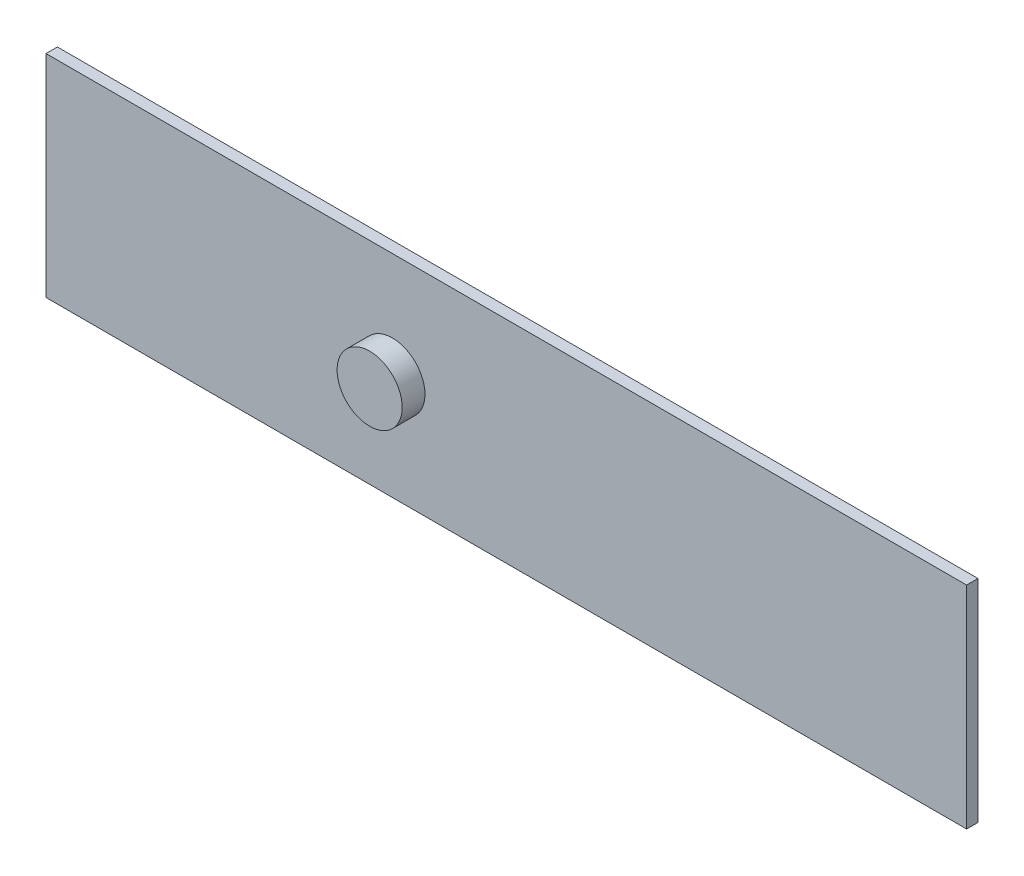
ISO-10303-21;
HEADER;
FILE_DESCRIPTION(('STEP AP214'),'2;1');
FILE_NAME('part.step','',(''),(''),'','','');
FILE_SCHEMA(('AUTOMOTIVE_DESIGN { 1 0 10303 214 1 1 1 1 }'));
ENDSEC;
DATA;
#1=APPLICATION_CONTEXT('core data for automotive mechanical design processes');
#2=APPLICATION_PROTOCOL_DEFINITION('international standard','automotive_design',2000,#1);
#3=PRODUCT_CONTEXT('',#1,'mechanical');
#4=PRODUCT('Part','Part','',(#3));
#5=PRODUCT_RELATED_PRODUCT_CATEGORY('part','',(#4));
#6=PRODUCT_DEFINITION_FORMATION('','',#4);
#7=PRODUCT_DEFINITION_CONTEXT('part definition',#1,'design');
#8=PRODUCT_DEFINITION('design','',#6,#7);
#9=PRODUCT_DEFINITION_SHAPE('','',#8);
#10=(LENGTH_UNIT() NAMED_UNIT(*) SI_UNIT(.MILLI.,.METRE.));
#11=(NAMED_UNIT(*) PLANE_ANGLE_UNIT() SI_UNIT($,.RADIAN.));
#12=(NAMED_UNIT(*) SI_UNIT($,.STERADIAN.) SOLID_ANGLE_UNIT());
#13=UNCERTAINTY_MEASURE_WITH_UNIT(LENGTH_MEASURE(1.E-05),#10,'distance_accuracy_value','');
#14=(GEOMETRIC_REPRESENTATION_CONTEXT(3) GLOBAL_UNCERTAINTY_ASSIGNED_CONTEXT((#13)) GLOBAL_UNIT_ASSIGNED_CONTEXT((#10,
#11,#12)) REPRESENTATION_CONTEXT('',''));
#15=CARTESIAN_POINT('',(0.,0.,0.));
#16=DIRECTION('',(0.,0.,1.));
#17=DIRECTION('',(1.,0.,0.));
#18=AXIS2_PLACEMENT_3D('',#15,#16,#17);
#19=CARTESIAN_POINT('',(-282.94,-64.94,3.5));
#20=DIRECTION('',(0.,1.,0.));
#21=DIRECTION('',(-1.,0.,0.));
#22=AXIS2_PLACEMENT_3D('',#19,#20,#21);
#23=PLANE('',#22);
#24=DIRECTION('',(1.,0.,0.));
#25=VECTOR('',#24,1.);
#26=CARTESIAN_POINT('',(-282.94,-64.94,-3.5));
#27=LINE('',#26,#25);
#28=CARTESIAN_POINT('',(-282.94,-64.94,-3.5));
#29=VERTEX_POINT('',#28);
#30=CARTESIAN_POINT('',(282.94,-64.94,-3.5));
#31=VERTEX_POINT('',#30);
#32=EDGE_CURVE('E99',#29,#31,#27,.T.);
#33=ORIENTED_EDGE('',*,*,#32,.T.);
#34=DIRECTION('',(0.,0.,-1.));
#35=VECTOR('',#34,1.);
#36=CARTESIAN_POINT('',(282.94,-64.94,3.5));
#37=LINE('',#36,#35);
#38=CARTESIAN_POINT('',(282.94,-64.94,3.5));
#39=VERTEX_POINT('',#38);
#40=EDGE_CURVE('E11',#39,#31,#37,.T.);
#41=ORIENTED_EDGE('',*,*,#40,.F.);
#42=DIRECTION('',(1.,0.,0.));
#43=VECTOR('',#42,1.);
#44=CARTESIAN_POINT('',(-282.94,-64.94,3.5));
#45=LINE('',#44,#43);
#46=CARTESIAN_POINT('',(-282.94,-64.94,3.5));
#47=VERTEX_POINT('',#46);
#48=EDGE_CURVE('E87',#47,#39,#45,.T.);
#49=ORIENTED_EDGE('',*,*,#48,.F.);
#50=DIRECTION('',(0.,0.,-1.));
#51=VECTOR('',#50,1.);
#52=CARTESIAN_POINT('',(-282.94,-64.94,3.5));
#53=LINE('',#52,#51);
#54=EDGE_CURVE('E95',#47,#29,#53,.T.);
#55=ORIENTED_EDGE('',*,*,#54,.T.);
#56=EDGE_LOOP('',(#33,#41,#49,#55));
#57=FACE_BOUND('',#56,.T.);
#58=ADVANCED_FACE('F36',(#57),#23,.F.);
#59=CARTESIAN_POINT('',(282.94,-64.94,3.5));
#60=DIRECTION('',(-1.,0.,0.));
#61=DIRECTION('',(0.,0.,1.));
#62=AXIS2_PLACEMENT_3D('',#59,#60,#61);
#63=PLANE('',#62);
#64=DIRECTION('',(0.,1.,0.));
#65=VECTOR('',#64,1.);
#66=CARTESIAN_POINT('',(282.94,-64.94,-3.5));
#67=LINE('',#66,#65);
#68=CARTESIAN_POINT('',(282.94,64.94,-3.5));
#69=VERTEX_POINT('',#68);
#70=EDGE_CURVE('E91',#31,#69,#67,.T.);
#71=ORIENTED_EDGE('',*,*,#70,.T.);
#72=DIRECTION('',(0.,0.,-1.));
#73=VECTOR('',#72,1.);
#74=CARTESIAN_POINT('',(282.94,64.94,3.5));
#75=LINE('',#74,#73);
#76=CARTESIAN_POINT('',(282.94,64.94,3.5));
#77=VERTEX_POINT('',#76);
#78=EDGE_CURVE('E44',#77,#69,#75,.T.);
#79=ORIENTED_EDGE('',*,*,#78,.F.);
#80=DIRECTION('',(0.,1.,0.));
#81=VECTOR('',#80,1.);
#82=CARTESIAN_POINT('',(282.94,-64.94,3.5));
#83=LINE('',#82,#81);
#84=EDGE_CURVE('E82',#39,#77,#83,.T.);
#85=ORIENTED_EDGE('',*,*,#84,.F.);
#86=ORIENTED_EDGE('',*,*,#40,.T.);
#87=EDGE_LOOP('',(#71,#79,#85,#86));
#88=FACE_BOUND('',#87,.T.);
#89=ADVANCED_FACE('F90',(#88),#63,.F.);
#90=CARTESIAN_POINT('',(-282.94,64.94,3.5));
#91=DIRECTION('',(0.,-1.,0.));
#92=DIRECTION('',(1.,0.,0.));
#93=AXIS2_PLACEMENT_3D('',#90,#91,#92);
#94=PLANE('',#93);
#95=DIRECTION('',(-1.,0.,0.));
#96=VECTOR('',#95,1.);
#97=CARTESIAN_POINT('',(-282.94,64.94,-3.5));
#98=LINE('',#97,#96);
#99=CARTESIAN_POINT('',(-282.94,64.94,-3.5));
#100=VERTEX_POINT('',#99);
#101=EDGE_CURVE('E69',#69,#100,#98,.T.);
#102=ORIENTED_EDGE('',*,*,#101,.T.);
#103=DIRECTION('',(0.,0.,-1.));
#104=VECTOR('',#103,1.);
#105=CARTESIAN_POINT('',(-282.94,64.94,3.5));
#106=LINE('',#105,#104);
#107=CARTESIAN_POINT('',(-282.94,64.94,3.5));
#108=VERTEX_POINT('',#107);
#109=EDGE_CURVE('E92',#108,#100,#106,.T.);
#110=ORIENTED_EDGE('',*,*,#109,.F.);
#111=DIRECTION('',(-1.,0.,0.));
#112=VECTOR('',#111,1.);
#113=CARTESIAN_POINT('',(-282.94,64.94,3.5));
#114=LINE('',#113,#112);
#115=EDGE_CURVE('E85',#77,#108,#114,.T.);
#116=ORIENTED_EDGE('',*,*,#115,.F.);
#117=ORIENTED_EDGE('',*,*,#78,.T.);
#118=EDGE_LOOP('',(#102,#110,#116,#117));
#119=FACE_BOUND('',#118,.T.);
#120=ADVANCED_FACE('F93',(#119),#94,.F.);
#121=CARTESIAN_POINT('',(-282.94,-64.94,3.5));
#122=DIRECTION('',(1.,0.,0.));
#123=DIRECTION('',(0.,0.,-1.));
#124=AXIS2_PLACEMENT_3D('',#121,#122,#123);
#125=PLANE('',#124);
#126=DIRECTION('',(0.,-1.,0.));
#127=VECTOR('',#126,1.);
#128=CARTESIAN_POINT('',(-282.94,-64.94,-3.5));
#129=LINE('',#128,#127);
#130=EDGE_CURVE('E75',#100,#29,#129,.T.);
#131=ORIENTED_EDGE('',*,*,#130,.T.);
#132=ORIENTED_EDGE('',*,*,#54,.F.);
#133=DIRECTION('',(0.,-1.,0.));
#134=VECTOR('',#133,1.);
#135=CARTESIAN_POINT('',(-282.94,-64.94,3.5));
#136=LINE('',#135,#134);
#137=EDGE_CURVE('E52',#108,#47,#136,.T.);
#138=ORIENTED_EDGE('',*,*,#137,.F.);
#139=ORIENTED_EDGE('',*,*,#109,.T.);
#140=EDGE_LOOP('',(#131,#132,#138,#139));
#141=FACE_BOUND('',#140,.T.);
#142=ADVANCED_FACE('F107',(#141),#125,.F.);
#143=CARTESIAN_POINT('',(0.,0.,3.5));
#144=DIRECTION('',(0.,0.,1.));
#145=DIRECTION('',(1.,0.,0.));
#146=AXIS2_PLACEMENT_3D('',#143,#144,#145);
#147=PLANE('',#146);
#148=CARTESIAN_POINT('',(-70.,0.,3.5));
#149=DIRECTION('',(0.,0.,1.));
#150=DIRECTION('',(1.,0.,0.));
#151=AXIS2_PLACEMENT_3D('',#148,#149,#150);
#152=CIRCLE('',#151,20.);
#153=CARTESIAN_POINT('',(-50.,0.,3.5));
#154=VERTEX_POINT('',#153);
#155=EDGE_CURVE('E113',#154,#154,#152,.T.);
#156=ORIENTED_EDGE('',*,*,#155,.F.);
#157=EDGE_LOOP('',(#156));
#158=FACE_BOUND('',#157,.T.);
#159=ORIENTED_EDGE('',*,*,#48,.T.);
#160=ORIENTED_EDGE('',*,*,#84,.T.);
#161=ORIENTED_EDGE('',*,*,#115,.T.);
#162=ORIENTED_EDGE('',*,*,#137,.T.);
#163=EDGE_LOOP('',(#159,#160,#161,#162));
#164=FACE_BOUND('',#163,.T.);
#165=ADVANCED_FACE('F83',(#158,#164),#147,.T.);
#166=CARTESIAN_POINT('',(0.,0.,-3.5));
#167=DIRECTION('',(0.,0.,1.));
#168=DIRECTION('',(1.,0.,0.));
#169=AXIS2_PLACEMENT_3D('',#166,#167,#168);
#170=PLANE('',#169);
#171=ORIENTED_EDGE('',*,*,#32,.F.);
#172=ORIENTED_EDGE('',*,*,#130,.F.);
#173=ORIENTED_EDGE('',*,*,#101,.F.);
#174=ORIENTED_EDGE('',*,*,#70,.F.);
#175=EDGE_LOOP('',(#171,#172,#173,#174));
#176=FACE_BOUND('',#175,.T.);
#177=ADVANCED_FACE('F110',(#176),#170,.F.);
#178=CARTESIAN_POINT('',(-70.,0.,17.5));
#179=DIRECTION('',(0.,0.,-1.));
#180=DIRECTION('',(-1.,0.,0.));
#181=AXIS2_PLACEMENT_3D('',#178,#179,#180);
#182=CYLINDRICAL_SURFACE('',#181,20.);
#183=CARTESIAN_POINT('',(-70.,0.,17.5));
#184=DIRECTION('',(0.,0.,1.));
#185=DIRECTION('',(1.,0.,0.));
#186=AXIS2_PLACEMENT_3D('',#183,#184,#185);
#187=CIRCLE('',#186,20.);
#188=CARTESIAN_POINT('',(-50.,0.,17.5));
#189=VERTEX_POINT('',#188);
#190=EDGE_CURVE('E102',#189,#189,#187,.T.);
#191=ORIENTED_EDGE('',*,*,#190,.F.);
#192=EDGE_LOOP('',(#191));
#193=FACE_BOUND('',#192,.T.);
#194=ORIENTED_EDGE('',*,*,#155,.T.);
#195=EDGE_LOOP('',(#194));
#196=FACE_BOUND('',#195,.T.);
#197=ADVANCED_FACE('F121',(#193,#196),#182,.T.);
#198=CARTESIAN_POINT('',(-70.,0.,17.5));
#199=DIRECTION('',(0.,0.,1.));
#200=DIRECTION('',(1.,0.,0.));
#201=AXIS2_PLACEMENT_3D('',#198,#199,#200);
#202=PLANE('',#201);
#203=ORIENTED_EDGE('',*,*,#190,.T.);
#204=EDGE_LOOP('',(#203));
#205=FACE_BOUND('',#204,.T.);
#206=ADVANCED_FACE('F119',(#205),#202,.T.);
#207=CLOSED_SHELL('',(#58,#89,#120,#142,#165,#177,#197,#206));
#208=MANIFOLD_SOLID_BREP('B2',#207);
#209=ADVANCED_BREP_SHAPE_REPRESENTATION('',(#18,#208),#14);
#210=SHAPE_DEFINITION_REPRESENTATION(#9,#209);
ENDSEC;
END-ISO-10303-21;
